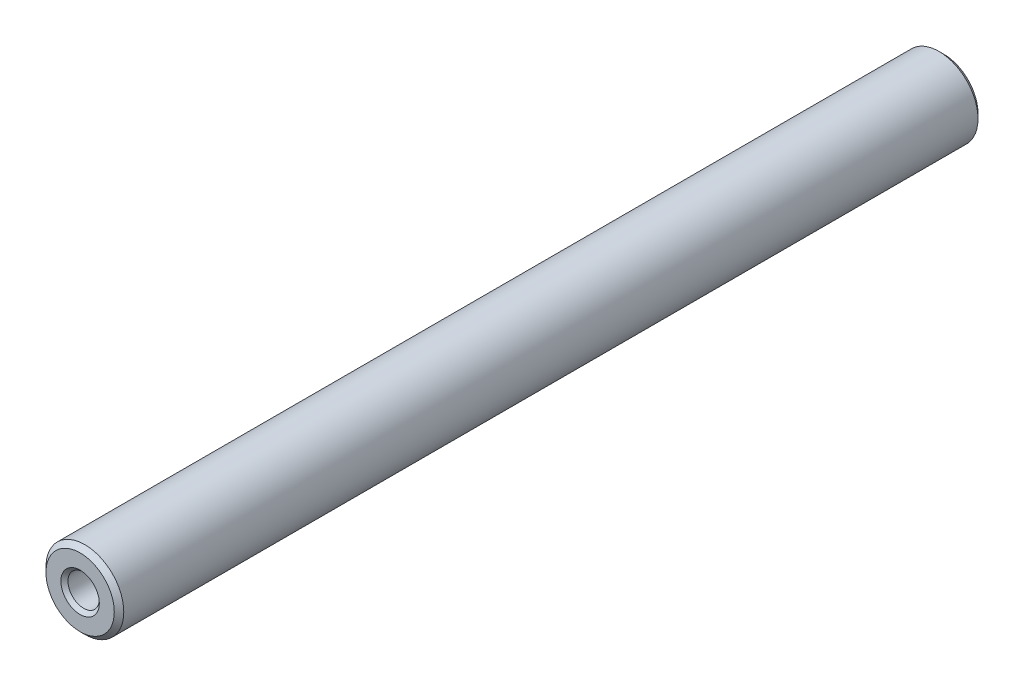
ISO-10303-21;
HEADER;
FILE_DESCRIPTION(('STEP AP214'),'2;1');
FILE_NAME('part.step','',(''),(''),'','','');
FILE_SCHEMA(('AUTOMOTIVE_DESIGN { 1 0 10303 214 1 1 1 1 }'));
ENDSEC;
DATA;
#1=APPLICATION_CONTEXT('core data for automotive mechanical design processes');
#2=APPLICATION_PROTOCOL_DEFINITION('international standard','automotive_design',2000,#1);
#3=PRODUCT_CONTEXT('',#1,'mechanical');
#4=PRODUCT('Part','Part','',(#3));
#5=PRODUCT_RELATED_PRODUCT_CATEGORY('part','',(#4));
#6=PRODUCT_DEFINITION_FORMATION('','',#4);
#7=PRODUCT_DEFINITION_CONTEXT('part definition',#1,'design');
#8=PRODUCT_DEFINITION('design','',#6,#7);
#9=PRODUCT_DEFINITION_SHAPE('','',#8);
#10=(LENGTH_UNIT() NAMED_UNIT(*) SI_UNIT(.MILLI.,.METRE.));
#11=(NAMED_UNIT(*) PLANE_ANGLE_UNIT() SI_UNIT($,.RADIAN.));
#12=(NAMED_UNIT(*) SI_UNIT($,.STERADIAN.) SOLID_ANGLE_UNIT());
#13=UNCERTAINTY_MEASURE_WITH_UNIT(LENGTH_MEASURE(1.E-05),#10,'distance_accuracy_value','');
#14=(GEOMETRIC_REPRESENTATION_CONTEXT(3) GLOBAL_UNCERTAINTY_ASSIGNED_CONTEXT((#13)) GLOBAL_UNIT_ASSIGNED_CONTEXT((#10,
#11,#12)) REPRESENTATION_CONTEXT('',''));
#15=CARTESIAN_POINT('',(0.,0.,0.));
#16=DIRECTION('',(0.,0.,1.));
#17=DIRECTION('',(1.,0.,0.));
#18=AXIS2_PLACEMENT_3D('',#15,#16,#17);
#19=CARTESIAN_POINT('',(0.,0.,-91.));
#20=DIRECTION('',(0.,0.,1.));
#21=DIRECTION('',(1.,0.,0.));
#22=AXIS2_PLACEMENT_3D('',#19,#20,#21);
#23=CYLINDRICAL_SURFACE('',#22,4.1);
#24=CARTESIAN_POINT('',(0.,0.,-90.5));
#25=DIRECTION('',(0.,0.,1.));
#26=DIRECTION('',(1.,0.,0.));
#27=AXIS2_PLACEMENT_3D('',#24,#25,#26);
#28=CIRCLE('',#27,4.1);
#29=CARTESIAN_POINT('',(4.1,0.,-90.5));
#30=VERTEX_POINT('',#29);
#31=EDGE_CURVE('E98',#30,#30,#28,.T.);
#32=ORIENTED_EDGE('',*,*,#31,.T.);
#33=EDGE_LOOP('',(#32));
#34=FACE_BOUND('',#33,.T.);
#35=CARTESIAN_POINT('',(0.,0.,-0.500000000000028));
#36=DIRECTION('',(0.,0.,1.));
#37=DIRECTION('',(1.,0.,0.));
#38=AXIS2_PLACEMENT_3D('',#35,#36,#37);
#39=CIRCLE('',#38,4.1);
#40=CARTESIAN_POINT('',(4.1,0.,-0.500000000000028));
#41=VERTEX_POINT('',#40);
#42=EDGE_CURVE('E94',#41,#41,#39,.F.);
#43=ORIENTED_EDGE('',*,*,#42,.T.);
#44=EDGE_LOOP('',(#43));
#45=FACE_BOUND('',#44,.T.);
#46=ADVANCED_FACE('F47',(#34,#45),#23,.T.);
#47=CARTESIAN_POINT('',(0.,0.,-91.));
#48=DIRECTION('',(0.,0.,1.));
#49=DIRECTION('',(1.,0.,0.));
#50=AXIS2_PLACEMENT_3D('',#47,#48,#49);
#51=PLANE('',#50);
#52=CARTESIAN_POINT('',(0.,0.,-91.));
#53=DIRECTION('',(0.,0.,1.));
#54=DIRECTION('',(1.,0.,0.));
#55=AXIS2_PLACEMENT_3D('',#52,#53,#54);
#56=CIRCLE('',#55,3.60000000000001);
#57=CARTESIAN_POINT('',(3.60000000000001,0.,-91.));
#58=VERTEX_POINT('',#57);
#59=EDGE_CURVE('E57',#58,#58,#56,.F.);
#60=ORIENTED_EDGE('',*,*,#59,.T.);
#61=EDGE_LOOP('',(#60));
#62=FACE_BOUND('',#61,.T.);
#63=CARTESIAN_POINT('',(0.,0.,-91.));
#64=DIRECTION('',(0.,0.,-1.));
#65=DIRECTION('',(-1.,0.,0.));
#66=AXIS2_PLACEMENT_3D('',#63,#64,#65);
#67=CIRCLE('',#66,2.025);
#68=CARTESIAN_POINT('',(-2.025,0.,-91.));
#69=VERTEX_POINT('',#68);
#70=EDGE_CURVE('E83',#69,#69,#67,.T.);
#71=ORIENTED_EDGE('',*,*,#70,.F.);
#72=EDGE_LOOP('',(#71));
#73=FACE_BOUND('',#72,.T.);
#74=ADVANCED_FACE('F105',(#62,#73),#51,.F.);
#75=CARTESIAN_POINT('',(0.,0.,0.));
#76=DIRECTION('',(0.,0.,1.));
#77=DIRECTION('',(1.,0.,0.));
#78=AXIS2_PLACEMENT_3D('',#75,#76,#77);
#79=PLANE('',#78);
#80=CARTESIAN_POINT('',(0.,0.,0.));
#81=DIRECTION('',(0.,0.,1.));
#82=DIRECTION('',(1.,0.,0.));
#83=AXIS2_PLACEMENT_3D('',#80,#81,#82);
#84=CIRCLE('',#83,3.59999999999998);
#85=CARTESIAN_POINT('',(3.59999999999998,0.,0.));
#86=VERTEX_POINT('',#85);
#87=EDGE_CURVE('E11',#86,#86,#84,.T.);
#88=ORIENTED_EDGE('',*,*,#87,.T.);
#89=EDGE_LOOP('',(#88));
#90=FACE_BOUND('',#89,.T.);
#91=CARTESIAN_POINT('',(0.,0.,0.));
#92=DIRECTION('',(0.,0.,1.));
#93=DIRECTION('',(1.,0.,0.));
#94=AXIS2_PLACEMENT_3D('',#91,#92,#93);
#95=CIRCLE('',#94,2.025);
#96=CARTESIAN_POINT('',(2.025,0.,0.));
#97=VERTEX_POINT('',#96);
#98=EDGE_CURVE('E74',#97,#97,#95,.T.);
#99=ORIENTED_EDGE('',*,*,#98,.F.);
#100=EDGE_LOOP('',(#99));
#101=FACE_BOUND('',#100,.T.);
#102=ADVANCED_FACE('F123',(#90,#101),#79,.T.);
#103=CARTESIAN_POINT('',(0.,0.,-10.5085799786045));
#104=DIRECTION('',(0.,0.,1.));
#105=DIRECTION('',(1.,0.,0.));
#106=AXIS2_PLACEMENT_3D('',#103,#104,#105);
#107=CONICAL_SURFACE('',#106,1.65,1.02974425867665);
#108=CARTESIAN_POINT('',(0.,0.,-11.5));
#109=VERTEX_POINT('',#108);
#110=VERTEX_LOOP('',#109);
#111=FACE_BOUND('',#110,.T.);
#112=CARTESIAN_POINT('',(0.,0.,-10.5085799786045));
#113=DIRECTION('',(0.,0.,1.));
#114=DIRECTION('',(1.,0.,0.));
#115=AXIS2_PLACEMENT_3D('',#112,#113,#114);
#116=CIRCLE('',#115,1.65);
#117=CARTESIAN_POINT('',(1.65,0.,-10.5085799786045));
#118=VERTEX_POINT('',#117);
#119=EDGE_CURVE('E90',#118,#118,#116,.T.);
#120=ORIENTED_EDGE('',*,*,#119,.T.);
#121=EDGE_LOOP('',(#120));
#122=FACE_BOUND('',#121,.T.);
#123=ADVANCED_FACE('F126',(#111,#122),#107,.F.);
#124=CARTESIAN_POINT('',(0.,0.,0.));
#125=DIRECTION('',(0.,0.,1.));
#126=DIRECTION('',(1.,0.,0.));
#127=AXIS2_PLACEMENT_3D('',#124,#125,#126);
#128=CYLINDRICAL_SURFACE('',#127,1.65);
#129=ORIENTED_EDGE('',*,*,#119,.F.);
#130=EDGE_LOOP('',(#129));
#131=FACE_BOUND('',#130,.T.);
#132=CARTESIAN_POINT('',(0.,0.,-0.375));
#133=DIRECTION('',(0.,0.,1.));
#134=DIRECTION('',(1.,0.,0.));
#135=AXIS2_PLACEMENT_3D('',#132,#133,#134);
#136=CIRCLE('',#135,1.65);
#137=CARTESIAN_POINT('',(1.65,0.,-0.375));
#138=VERTEX_POINT('',#137);
#139=EDGE_CURVE('E80',#138,#138,#136,.T.);
#140=ORIENTED_EDGE('',*,*,#139,.T.);
#141=EDGE_LOOP('',(#140));
#142=FACE_BOUND('',#141,.T.);
#143=ADVANCED_FACE('F131',(#131,#142),#128,.F.);
#144=CARTESIAN_POINT('',(0.,0.,0.));
#145=DIRECTION('',(0.,0.,1.));
#146=DIRECTION('',(1.,0.,0.));
#147=AXIS2_PLACEMENT_3D('',#144,#145,#146);
#148=CONICAL_SURFACE('',#147,2.025,0.785398163397446);
#149=ORIENTED_EDGE('',*,*,#139,.F.);
#150=EDGE_LOOP('',(#149));
#151=FACE_BOUND('',#150,.T.);
#152=ORIENTED_EDGE('',*,*,#98,.T.);
#153=EDGE_LOOP('',(#152));
#154=FACE_BOUND('',#153,.T.);
#155=ADVANCED_FACE('F67',(#151,#154),#148,.F.);
#156=CARTESIAN_POINT('',(0.,0.,-80.4914200213955));
#157=DIRECTION('',(0.,0.,-1.));
#158=DIRECTION('',(-1.,0.,0.));
#159=AXIS2_PLACEMENT_3D('',#156,#157,#158);
#160=CONICAL_SURFACE('',#159,1.65,1.02974425867665);
#161=CARTESIAN_POINT('',(0.,0.,-79.5));
#162=VERTEX_POINT('',#161);
#163=VERTEX_LOOP('',#162);
#164=FACE_BOUND('',#163,.T.);
#165=CARTESIAN_POINT('',(0.,0.,-80.4914200213955));
#166=DIRECTION('',(0.,0.,-1.));
#167=DIRECTION('',(-1.,0.,0.));
#168=AXIS2_PLACEMENT_3D('',#165,#166,#167);
#169=CIRCLE('',#168,1.65);
#170=CARTESIAN_POINT('',(-1.65,0.,-80.4914200213955));
#171=VERTEX_POINT('',#170);
#172=EDGE_CURVE('E71',#171,#171,#169,.T.);
#173=ORIENTED_EDGE('',*,*,#172,.T.);
#174=EDGE_LOOP('',(#173));
#175=FACE_BOUND('',#174,.T.);
#176=ADVANCED_FACE('F63',(#164,#175),#160,.F.);
#177=CARTESIAN_POINT('',(0.,0.,-91.));
#178=DIRECTION('',(0.,0.,-1.));
#179=DIRECTION('',(-1.,0.,0.));
#180=AXIS2_PLACEMENT_3D('',#177,#178,#179);
#181=CYLINDRICAL_SURFACE('',#180,1.64999999999999);
#182=ORIENTED_EDGE('',*,*,#172,.F.);
#183=EDGE_LOOP('',(#182));
#184=FACE_BOUND('',#183,.T.);
#185=CARTESIAN_POINT('',(0.,0.,-90.625));
#186=DIRECTION('',(0.,0.,-1.));
#187=DIRECTION('',(-1.,0.,0.));
#188=AXIS2_PLACEMENT_3D('',#185,#186,#187);
#189=CIRCLE('',#188,1.64999999999999);
#190=CARTESIAN_POINT('',(-1.64999999999999,0.,-90.625));
#191=VERTEX_POINT('',#190);
#192=EDGE_CURVE('E75',#191,#191,#189,.T.);
#193=ORIENTED_EDGE('',*,*,#192,.T.);
#194=EDGE_LOOP('',(#193));
#195=FACE_BOUND('',#194,.T.);
#196=ADVANCED_FACE('F66',(#184,#195),#181,.F.);
#197=CARTESIAN_POINT('',(0.,0.,-91.));
#198=DIRECTION('',(0.,0.,-1.));
#199=DIRECTION('',(-1.,0.,0.));
#200=AXIS2_PLACEMENT_3D('',#197,#198,#199);
#201=CONICAL_SURFACE('',#200,2.025,0.78539816339746);
#202=ORIENTED_EDGE('',*,*,#192,.F.);
#203=EDGE_LOOP('',(#202));
#204=FACE_BOUND('',#203,.T.);
#205=ORIENTED_EDGE('',*,*,#70,.T.);
#206=EDGE_LOOP('',(#205));
#207=FACE_BOUND('',#206,.T.);
#208=ADVANCED_FACE('F111',(#204,#207),#201,.F.);
#209=CARTESIAN_POINT('',(0.,0.,-90.5));
#210=DIRECTION('',(0.,0.,1.));
#211=DIRECTION('',(1.,0.,0.));
#212=AXIS2_PLACEMENT_3D('',#209,#210,#211);
#213=CONICAL_SURFACE('',#212,4.1,0.785398163397442);
#214=ORIENTED_EDGE('',*,*,#59,.F.);
#215=EDGE_LOOP('',(#214));
#216=FACE_BOUND('',#215,.T.);
#217=ORIENTED_EDGE('',*,*,#31,.F.);
#218=EDGE_LOOP('',(#217));
#219=FACE_BOUND('',#218,.T.);
#220=ADVANCED_FACE('F108',(#216,#219),#213,.T.);
#221=CARTESIAN_POINT('',(0.,0.,0.));
#222=DIRECTION('',(0.,0.,-1.));
#223=DIRECTION('',(-1.,0.,0.));
#224=AXIS2_PLACEMENT_3D('',#221,#222,#223);
#225=CONICAL_SURFACE('',#224,3.59999999999998,0.785398163397442);
#226=ORIENTED_EDGE('',*,*,#42,.F.);
#227=EDGE_LOOP('',(#226));
#228=FACE_BOUND('',#227,.T.);
#229=ORIENTED_EDGE('',*,*,#87,.F.);
#230=EDGE_LOOP('',(#229));
#231=FACE_BOUND('',#230,.T.);
#232=ADVANCED_FACE('F50',(#228,#231),#225,.T.);
#233=CLOSED_SHELL('',(#46,#74,#102,#123,#143,#155,#176,#196,#208,#220,#232));
#234=MANIFOLD_SOLID_BREP('B2',#233);
#235=ADVANCED_BREP_SHAPE_REPRESENTATION('',(#18,#234),#14);
#236=SHAPE_DEFINITION_REPRESENTATION(#9,#235);
ENDSEC;
END-ISO-10303-21;
